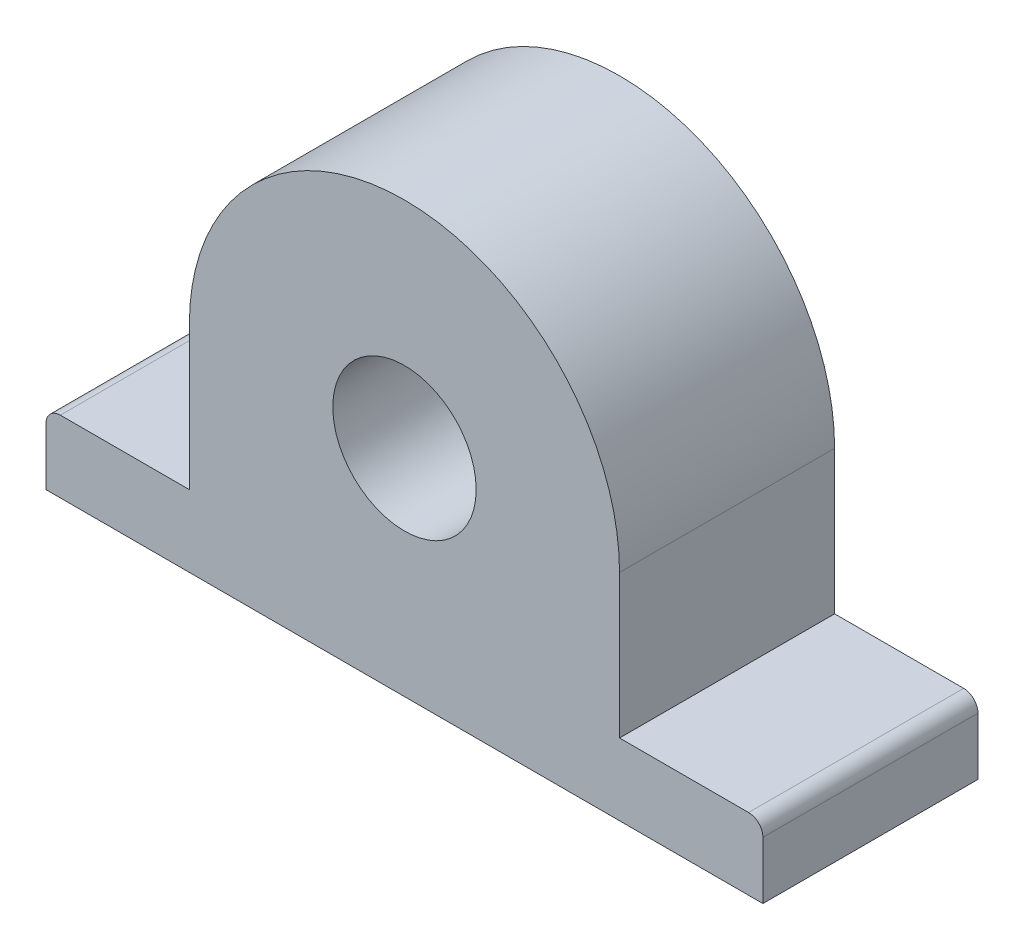
ISO-10303-21;
HEADER;
FILE_DESCRIPTION(('STEP AP214'),'2;1');
FILE_NAME('part.step','',(''),(''),'','','');
FILE_SCHEMA(('AUTOMOTIVE_DESIGN { 1 0 10303 214 1 1 1 1 }'));
ENDSEC;
DATA;
#1=APPLICATION_CONTEXT('core data for automotive mechanical design processes');
#2=APPLICATION_PROTOCOL_DEFINITION('international standard','automotive_design',2000,#1);
#3=PRODUCT_CONTEXT('',#1,'mechanical');
#4=PRODUCT('Part','Part','',(#3));
#5=PRODUCT_RELATED_PRODUCT_CATEGORY('part','',(#4));
#6=PRODUCT_DEFINITION_FORMATION('','',#4);
#7=PRODUCT_DEFINITION_CONTEXT('part definition',#1,'design');
#8=PRODUCT_DEFINITION('design','',#6,#7);
#9=PRODUCT_DEFINITION_SHAPE('','',#8);
#10=(LENGTH_UNIT() NAMED_UNIT(*) SI_UNIT(.MILLI.,.METRE.));
#11=(NAMED_UNIT(*) PLANE_ANGLE_UNIT() SI_UNIT($,.RADIAN.));
#12=(NAMED_UNIT(*) SI_UNIT($,.STERADIAN.) SOLID_ANGLE_UNIT());
#13=UNCERTAINTY_MEASURE_WITH_UNIT(LENGTH_MEASURE(1.E-05),#10,'distance_accuracy_value','');
#14=(GEOMETRIC_REPRESENTATION_CONTEXT(3) GLOBAL_UNCERTAINTY_ASSIGNED_CONTEXT((#13)) GLOBAL_UNIT_ASSIGNED_CONTEXT((#10,
#11,#12)) REPRESENTATION_CONTEXT('',''));
#15=CARTESIAN_POINT('',(0.,0.,0.));
#16=DIRECTION('',(0.,0.,1.));
#17=DIRECTION('',(1.,0.,0.));
#18=AXIS2_PLACEMENT_3D('',#15,#16,#17);
#19=CARTESIAN_POINT('',(0.,12.5,15.));
#20=DIRECTION('',(0.,0.,1.));
#21=DIRECTION('',(1.,0.,0.));
#22=AXIS2_PLACEMENT_3D('',#19,#20,#21);
#23=PLANE('',#22);
#24=DIRECTION('',(-1.,0.,0.));
#25=VECTOR('',#24,1.);
#26=CARTESIAN_POINT('',(-25.,2.5,15.));
#27=LINE('',#26,#25);
#28=CARTESIAN_POINT('',(-15.,2.5,15.));
#29=VERTEX_POINT('',#28);
#30=CARTESIAN_POINT('',(-24.,2.5,15.));
#31=VERTEX_POINT('',#30);
#32=EDGE_CURVE('E147',#29,#31,#27,.T.);
#33=ORIENTED_EDGE('',*,*,#32,.T.);
#34=CARTESIAN_POINT('',(-24.,1.5,15.));
#35=DIRECTION('',(0.,0.,1.));
#36=DIRECTION('',(1.,0.,0.));
#37=AXIS2_PLACEMENT_3D('',#34,#35,#36);
#38=CIRCLE('',#37,1.);
#39=CARTESIAN_POINT('',(-25.,1.5,15.));
#40=VERTEX_POINT('',#39);
#41=EDGE_CURVE('E192',#31,#40,#38,.T.);
#42=ORIENTED_EDGE('',*,*,#41,.T.);
#43=DIRECTION('',(0.,-1.,0.));
#44=VECTOR('',#43,1.);
#45=CARTESIAN_POINT('',(-25.,2.5,15.));
#46=LINE('',#45,#44);
#47=CARTESIAN_POINT('',(-25.,-2.5,15.));
#48=VERTEX_POINT('',#47);
#49=EDGE_CURVE('E149',#40,#48,#46,.T.);
#50=ORIENTED_EDGE('',*,*,#49,.T.);
#51=DIRECTION('',(1.,0.,0.));
#52=VECTOR('',#51,1.);
#53=CARTESIAN_POINT('',(-25.,-2.5,15.));
#54=LINE('',#53,#52);
#55=CARTESIAN_POINT('',(25.,-2.5,15.));
#56=VERTEX_POINT('',#55);
#57=EDGE_CURVE('E151',#48,#56,#54,.T.);
#58=ORIENTED_EDGE('',*,*,#57,.T.);
#59=DIRECTION('',(0.,1.,0.));
#60=VECTOR('',#59,1.);
#61=CARTESIAN_POINT('',(25.,2.5,15.));
#62=LINE('',#61,#60);
#63=CARTESIAN_POINT('',(25.,1.5,15.));
#64=VERTEX_POINT('',#63);
#65=EDGE_CURVE('E125',#56,#64,#62,.T.);
#66=ORIENTED_EDGE('',*,*,#65,.T.);
#67=CARTESIAN_POINT('',(24.,1.5,15.));
#68=DIRECTION('',(0.,0.,1.));
#69=DIRECTION('',(1.,0.,0.));
#70=AXIS2_PLACEMENT_3D('',#67,#68,#69);
#71=CIRCLE('',#70,1.);
#72=CARTESIAN_POINT('',(24.,2.5,15.));
#73=VERTEX_POINT('',#72);
#74=EDGE_CURVE('E56',#64,#73,#71,.T.);
#75=ORIENTED_EDGE('',*,*,#74,.T.);
#76=DIRECTION('',(-1.,0.,0.));
#77=VECTOR('',#76,1.);
#78=CARTESIAN_POINT('',(15.,2.5,15.));
#79=LINE('',#78,#77);
#80=CARTESIAN_POINT('',(15.,2.5,15.));
#81=VERTEX_POINT('',#80);
#82=EDGE_CURVE('E115',#73,#81,#79,.T.);
#83=ORIENTED_EDGE('',*,*,#82,.T.);
#84=DIRECTION('',(0.,1.,0.));
#85=VECTOR('',#84,1.);
#86=CARTESIAN_POINT('',(15.,12.5,15.));
#87=LINE('',#86,#85);
#88=CARTESIAN_POINT('',(15.,12.5,15.));
#89=VERTEX_POINT('',#88);
#90=EDGE_CURVE('E120',#81,#89,#87,.T.);
#91=ORIENTED_EDGE('',*,*,#90,.T.);
#92=CARTESIAN_POINT('',(0.,12.5,15.));
#93=DIRECTION('',(0.,0.,1.));
#94=DIRECTION('',(1.,0.,0.));
#95=AXIS2_PLACEMENT_3D('',#92,#93,#94);
#96=CIRCLE('',#95,15.);
#97=CARTESIAN_POINT('',(-15.,12.5,15.));
#98=VERTEX_POINT('',#97);
#99=EDGE_CURVE('E140',#89,#98,#96,.T.);
#100=ORIENTED_EDGE('',*,*,#99,.T.);
#101=DIRECTION('',(0.,-1.,0.));
#102=VECTOR('',#101,1.);
#103=CARTESIAN_POINT('',(-15.,12.5,15.));
#104=LINE('',#103,#102);
#105=EDGE_CURVE('E142',#98,#29,#104,.T.);
#106=ORIENTED_EDGE('',*,*,#105,.T.);
#107=EDGE_LOOP('',(#33,#42,#50,#58,#66,#75,#83,#91,#100,#106));
#108=FACE_BOUND('',#107,.T.);
#109=CARTESIAN_POINT('',(0.,12.5,15.));
#110=DIRECTION('',(0.,0.,1.));
#111=DIRECTION('',(1.,0.,0.));
#112=AXIS2_PLACEMENT_3D('',#109,#110,#111);
#113=CIRCLE('',#112,5.);
#114=CARTESIAN_POINT('',(5.,12.5,15.));
#115=VERTEX_POINT('',#114);
#116=EDGE_CURVE('E156',#115,#115,#113,.T.);
#117=ORIENTED_EDGE('',*,*,#116,.F.);
#118=EDGE_LOOP('',(#117));
#119=FACE_BOUND('',#118,.T.);
#120=ADVANCED_FACE('F41',(#108,#119),#23,.T.);
#121=CARTESIAN_POINT('',(0.,12.5,0.));
#122=DIRECTION('',(0.,0.,1.));
#123=DIRECTION('',(1.,0.,0.));
#124=AXIS2_PLACEMENT_3D('',#121,#122,#123);
#125=PLANE('',#124);
#126=DIRECTION('',(0.,-1.,0.));
#127=VECTOR('',#126,1.);
#128=CARTESIAN_POINT('',(-25.,2.5,0.));
#129=LINE('',#128,#127);
#130=CARTESIAN_POINT('',(-25.,1.5,0.));
#131=VERTEX_POINT('',#130);
#132=CARTESIAN_POINT('',(-25.,-2.5,0.));
#133=VERTEX_POINT('',#132);
#134=EDGE_CURVE('E167',#131,#133,#129,.T.);
#135=ORIENTED_EDGE('',*,*,#134,.F.);
#136=CARTESIAN_POINT('',(-24.,1.5,0.));
#137=DIRECTION('',(0.,0.,1.));
#138=DIRECTION('',(1.,0.,0.));
#139=AXIS2_PLACEMENT_3D('',#136,#137,#138);
#140=CIRCLE('',#139,1.);
#141=CARTESIAN_POINT('',(-24.,2.5,0.));
#142=VERTEX_POINT('',#141);
#143=EDGE_CURVE('E187',#131,#142,#140,.F.);
#144=ORIENTED_EDGE('',*,*,#143,.T.);
#145=DIRECTION('',(-1.,0.,0.));
#146=VECTOR('',#145,1.);
#147=CARTESIAN_POINT('',(-25.,2.5,0.));
#148=LINE('',#147,#146);
#149=CARTESIAN_POINT('',(-15.,2.5,0.));
#150=VERTEX_POINT('',#149);
#151=EDGE_CURVE('E164',#150,#142,#148,.T.);
#152=ORIENTED_EDGE('',*,*,#151,.F.);
#153=DIRECTION('',(0.,-1.,0.));
#154=VECTOR('',#153,1.);
#155=CARTESIAN_POINT('',(-15.,12.5,0.));
#156=LINE('',#155,#154);
#157=CARTESIAN_POINT('',(-15.,12.5,0.));
#158=VERTEX_POINT('',#157);
#159=EDGE_CURVE('E162',#158,#150,#156,.T.);
#160=ORIENTED_EDGE('',*,*,#159,.F.);
#161=CARTESIAN_POINT('',(0.,12.5,0.));
#162=DIRECTION('',(0.,0.,1.));
#163=DIRECTION('',(1.,0.,0.));
#164=AXIS2_PLACEMENT_3D('',#161,#162,#163);
#165=CIRCLE('',#164,15.);
#166=CARTESIAN_POINT('',(15.,12.5,0.));
#167=VERTEX_POINT('',#166);
#168=EDGE_CURVE('E160',#167,#158,#165,.T.);
#169=ORIENTED_EDGE('',*,*,#168,.F.);
#170=DIRECTION('',(0.,1.,0.));
#171=VECTOR('',#170,1.);
#172=CARTESIAN_POINT('',(15.,12.5,0.));
#173=LINE('',#172,#171);
#174=CARTESIAN_POINT('',(15.,2.5,0.));
#175=VERTEX_POINT('',#174);
#176=EDGE_CURVE('E158',#175,#167,#173,.T.);
#177=ORIENTED_EDGE('',*,*,#176,.F.);
#178=DIRECTION('',(-1.,0.,0.));
#179=VECTOR('',#178,1.);
#180=CARTESIAN_POINT('',(15.,2.5,0.));
#181=LINE('',#180,#179);
#182=CARTESIAN_POINT('',(24.,2.5,0.));
#183=VERTEX_POINT('',#182);
#184=EDGE_CURVE('E131',#183,#175,#181,.T.);
#185=ORIENTED_EDGE('',*,*,#184,.F.);
#186=CARTESIAN_POINT('',(24.,1.5,0.));
#187=DIRECTION('',(0.,0.,1.));
#188=DIRECTION('',(1.,0.,0.));
#189=AXIS2_PLACEMENT_3D('',#186,#187,#188);
#190=CIRCLE('',#189,1.);
#191=CARTESIAN_POINT('',(25.,1.5,0.));
#192=VERTEX_POINT('',#191);
#193=EDGE_CURVE('E185',#183,#192,#190,.F.);
#194=ORIENTED_EDGE('',*,*,#193,.T.);
#195=DIRECTION('',(0.,1.,0.));
#196=VECTOR('',#195,1.);
#197=CARTESIAN_POINT('',(25.,2.5,0.));
#198=LINE('',#197,#196);
#199=CARTESIAN_POINT('',(25.,-2.5,0.));
#200=VERTEX_POINT('',#199);
#201=EDGE_CURVE('E154',#200,#192,#198,.T.);
#202=ORIENTED_EDGE('',*,*,#201,.F.);
#203=DIRECTION('',(1.,0.,0.));
#204=VECTOR('',#203,1.);
#205=CARTESIAN_POINT('',(-25.,-2.5,0.));
#206=LINE('',#205,#204);
#207=EDGE_CURVE('E169',#133,#200,#206,.T.);
#208=ORIENTED_EDGE('',*,*,#207,.F.);
#209=EDGE_LOOP('',(#135,#144,#152,#160,#169,#177,#185,#194,#202,#208));
#210=FACE_BOUND('',#209,.T.);
#211=CARTESIAN_POINT('',(0.,12.5,0.));
#212=DIRECTION('',(0.,0.,1.));
#213=DIRECTION('',(1.,0.,0.));
#214=AXIS2_PLACEMENT_3D('',#211,#212,#213);
#215=CIRCLE('',#214,5.);
#216=CARTESIAN_POINT('',(5.,12.5,0.));
#217=VERTEX_POINT('',#216);
#218=EDGE_CURVE('E336',#217,#217,#215,.T.);
#219=ORIENTED_EDGE('',*,*,#218,.T.);
#220=EDGE_LOOP('',(#219));
#221=FACE_BOUND('',#220,.T.);
#222=ADVANCED_FACE('F196',(#210,#221),#125,.F.);
#223=CARTESIAN_POINT('',(25.,2.5,15.));
#224=DIRECTION('',(-1.,0.,0.));
#225=DIRECTION('',(0.,0.,1.));
#226=AXIS2_PLACEMENT_3D('',#223,#224,#225);
#227=PLANE('',#226);
#228=ORIENTED_EDGE('',*,*,#201,.T.);
#229=DIRECTION('',(0.,0.,-1.));
#230=VECTOR('',#229,1.);
#231=CARTESIAN_POINT('',(25.,1.5,15.));
#232=LINE('',#231,#230);
#233=EDGE_CURVE('E11',#192,#64,#232,.F.);
#234=ORIENTED_EDGE('',*,*,#233,.T.);
#235=ORIENTED_EDGE('',*,*,#65,.F.);
#236=DIRECTION('',(0.,0.,-1.));
#237=VECTOR('',#236,1.);
#238=CARTESIAN_POINT('',(25.,-2.5,15.));
#239=LINE('',#238,#237);
#240=EDGE_CURVE('E153',#56,#200,#239,.T.);
#241=ORIENTED_EDGE('',*,*,#240,.T.);
#242=EDGE_LOOP('',(#228,#234,#235,#241));
#243=FACE_BOUND('',#242,.T.);
#244=ADVANCED_FACE('F237',(#243),#227,.F.);
#245=CARTESIAN_POINT('',(15.,2.5,15.));
#246=DIRECTION('',(0.,-1.,0.));
#247=DIRECTION('',(1.,0.,0.));
#248=AXIS2_PLACEMENT_3D('',#245,#246,#247);
#249=PLANE('',#248);
#250=ORIENTED_EDGE('',*,*,#82,.F.);
#251=DIRECTION('',(0.,0.,-1.));
#252=VECTOR('',#251,1.);
#253=CARTESIAN_POINT('',(24.,2.5,15.));
#254=LINE('',#253,#252);
#255=EDGE_CURVE('E49',#73,#183,#254,.T.);
#256=ORIENTED_EDGE('',*,*,#255,.T.);
#257=ORIENTED_EDGE('',*,*,#184,.T.);
#258=DIRECTION('',(0.,0.,-1.));
#259=VECTOR('',#258,1.);
#260=CARTESIAN_POINT('',(15.,2.5,15.));
#261=LINE('',#260,#259);
#262=EDGE_CURVE('E128',#81,#175,#261,.T.);
#263=ORIENTED_EDGE('',*,*,#262,.F.);
#264=EDGE_LOOP('',(#250,#256,#257,#263));
#265=FACE_BOUND('',#264,.T.);
#266=ADVANCED_FACE('F129',(#265),#249,.F.);
#267=CARTESIAN_POINT('',(15.,12.5,15.));
#268=DIRECTION('',(-1.,0.,0.));
#269=DIRECTION('',(0.,-1.,0.));
#270=AXIS2_PLACEMENT_3D('',#267,#268,#269);
#271=PLANE('',#270);
#272=ORIENTED_EDGE('',*,*,#176,.T.);
#273=DIRECTION('',(0.,0.,-1.));
#274=VECTOR('',#273,1.);
#275=CARTESIAN_POINT('',(15.,12.5,15.));
#276=LINE('',#275,#274);
#277=EDGE_CURVE('E135',#89,#167,#276,.T.);
#278=ORIENTED_EDGE('',*,*,#277,.F.);
#279=ORIENTED_EDGE('',*,*,#90,.F.);
#280=ORIENTED_EDGE('',*,*,#262,.T.);
#281=EDGE_LOOP('',(#272,#278,#279,#280));
#282=FACE_BOUND('',#281,.T.);
#283=ADVANCED_FACE('F137',(#282),#271,.F.);
#284=CARTESIAN_POINT('',(0.,12.5,15.));
#285=DIRECTION('',(0.,0.,-1.));
#286=DIRECTION('',(-1.,0.,0.));
#287=AXIS2_PLACEMENT_3D('',#284,#285,#286);
#288=CYLINDRICAL_SURFACE('',#287,15.);
#289=ORIENTED_EDGE('',*,*,#168,.T.);
#290=DIRECTION('',(0.,0.,-1.));
#291=VECTOR('',#290,1.);
#292=CARTESIAN_POINT('',(-15.,12.5,15.));
#293=LINE('',#292,#291);
#294=EDGE_CURVE('E179',#98,#158,#293,.T.);
#295=ORIENTED_EDGE('',*,*,#294,.F.);
#296=ORIENTED_EDGE('',*,*,#99,.F.);
#297=ORIENTED_EDGE('',*,*,#277,.T.);
#298=EDGE_LOOP('',(#289,#295,#296,#297));
#299=FACE_BOUND('',#298,.T.);
#300=ADVANCED_FACE('F202',(#299),#288,.T.);
#301=CARTESIAN_POINT('',(-15.,12.5,15.));
#302=DIRECTION('',(1.,0.,0.));
#303=DIRECTION('',(0.,1.,0.));
#304=AXIS2_PLACEMENT_3D('',#301,#302,#303);
#305=PLANE('',#304);
#306=ORIENTED_EDGE('',*,*,#159,.T.);
#307=DIRECTION('',(0.,0.,-1.));
#308=VECTOR('',#307,1.);
#309=CARTESIAN_POINT('',(-15.,2.5,15.));
#310=LINE('',#309,#308);
#311=EDGE_CURVE('E176',#29,#150,#310,.T.);
#312=ORIENTED_EDGE('',*,*,#311,.F.);
#313=ORIENTED_EDGE('',*,*,#105,.F.);
#314=ORIENTED_EDGE('',*,*,#294,.T.);
#315=EDGE_LOOP('',(#306,#312,#313,#314));
#316=FACE_BOUND('',#315,.T.);
#317=ADVANCED_FACE('F209',(#316),#305,.F.);
#318=CARTESIAN_POINT('',(-25.,2.5,15.));
#319=DIRECTION('',(0.,-1.,0.));
#320=DIRECTION('',(0.,0.,-1.));
#321=AXIS2_PLACEMENT_3D('',#318,#319,#320);
#322=PLANE('',#321);
#323=ORIENTED_EDGE('',*,*,#151,.T.);
#324=DIRECTION('',(0.,0.,-1.));
#325=VECTOR('',#324,1.);
#326=CARTESIAN_POINT('',(-24.,2.5,15.));
#327=LINE('',#326,#325);
#328=EDGE_CURVE('E189',#142,#31,#327,.F.);
#329=ORIENTED_EDGE('',*,*,#328,.T.);
#330=ORIENTED_EDGE('',*,*,#32,.F.);
#331=ORIENTED_EDGE('',*,*,#311,.T.);
#332=EDGE_LOOP('',(#323,#329,#330,#331));
#333=FACE_BOUND('',#332,.T.);
#334=ADVANCED_FACE('F212',(#333),#322,.F.);
#335=CARTESIAN_POINT('',(-25.,2.5,15.));
#336=DIRECTION('',(1.,0.,0.));
#337=DIRECTION('',(0.,0.,-1.));
#338=AXIS2_PLACEMENT_3D('',#335,#336,#337);
#339=PLANE('',#338);
#340=ORIENTED_EDGE('',*,*,#49,.F.);
#341=DIRECTION('',(0.,0.,-1.));
#342=VECTOR('',#341,1.);
#343=CARTESIAN_POINT('',(-25.,1.5,15.));
#344=LINE('',#343,#342);
#345=EDGE_CURVE('E134',#40,#131,#344,.T.);
#346=ORIENTED_EDGE('',*,*,#345,.T.);
#347=ORIENTED_EDGE('',*,*,#134,.T.);
#348=DIRECTION('',(0.,0.,-1.));
#349=VECTOR('',#348,1.);
#350=CARTESIAN_POINT('',(-25.,-2.5,15.));
#351=LINE('',#350,#349);
#352=EDGE_CURVE('E173',#48,#133,#351,.T.);
#353=ORIENTED_EDGE('',*,*,#352,.F.);
#354=EDGE_LOOP('',(#340,#346,#347,#353));
#355=FACE_BOUND('',#354,.T.);
#356=ADVANCED_FACE('F220',(#355),#339,.F.);
#357=CARTESIAN_POINT('',(-25.,-2.5,15.));
#358=DIRECTION('',(0.,1.,0.));
#359=DIRECTION('',(0.,0.,1.));
#360=AXIS2_PLACEMENT_3D('',#357,#358,#359);
#361=PLANE('',#360);
#362=ORIENTED_EDGE('',*,*,#207,.T.);
#363=ORIENTED_EDGE('',*,*,#240,.F.);
#364=ORIENTED_EDGE('',*,*,#57,.F.);
#365=ORIENTED_EDGE('',*,*,#352,.T.);
#366=EDGE_LOOP('',(#362,#363,#364,#365));
#367=FACE_BOUND('',#366,.T.);
#368=ADVANCED_FACE('F225',(#367),#361,.F.);
#369=CARTESIAN_POINT('',(0.,12.5,15.));
#370=DIRECTION('',(0.,0.,-1.));
#371=DIRECTION('',(-1.,0.,0.));
#372=AXIS2_PLACEMENT_3D('',#369,#370,#371);
#373=CYLINDRICAL_SURFACE('',#372,5.);
#374=ORIENTED_EDGE('',*,*,#116,.T.);
#375=EDGE_LOOP('',(#374));
#376=FACE_BOUND('',#375,.T.);
#377=ORIENTED_EDGE('',*,*,#218,.F.);
#378=EDGE_LOOP('',(#377));
#379=FACE_BOUND('',#378,.T.);
#380=ADVANCED_FACE('F230',(#376,#379),#373,.F.);
#381=CARTESIAN_POINT('',(-24.,1.5,15.));
#382=DIRECTION('',(0.,0.,-1.));
#383=DIRECTION('',(-1.,0.,0.));
#384=AXIS2_PLACEMENT_3D('',#381,#382,#383);
#385=CYLINDRICAL_SURFACE('',#384,1.);
#386=ORIENTED_EDGE('',*,*,#41,.F.);
#387=ORIENTED_EDGE('',*,*,#328,.F.);
#388=ORIENTED_EDGE('',*,*,#143,.F.);
#389=ORIENTED_EDGE('',*,*,#345,.F.);
#390=EDGE_LOOP('',(#386,#387,#388,#389));
#391=FACE_BOUND('',#390,.T.);
#392=ADVANCED_FACE('F215',(#391),#385,.T.);
#393=CARTESIAN_POINT('',(24.,1.5,15.));
#394=DIRECTION('',(0.,0.,-1.));
#395=DIRECTION('',(-1.,0.,0.));
#396=AXIS2_PLACEMENT_3D('',#393,#394,#395);
#397=CYLINDRICAL_SURFACE('',#396,1.);
#398=ORIENTED_EDGE('',*,*,#74,.F.);
#399=ORIENTED_EDGE('',*,*,#233,.F.);
#400=ORIENTED_EDGE('',*,*,#193,.F.);
#401=ORIENTED_EDGE('',*,*,#255,.F.);
#402=EDGE_LOOP('',(#398,#399,#400,#401));
#403=FACE_BOUND('',#402,.T.);
#404=ADVANCED_FACE('F43',(#403),#397,.T.);
#405=CLOSED_SHELL('',(#120,#222,#244,#266,#283,#300,#317,#334,#356,#368,#380,#392,#404));
#406=MANIFOLD_SOLID_BREP('B2',#405);
#407=ADVANCED_BREP_SHAPE_REPRESENTATION('',(#18,#406),#14);
#408=SHAPE_DEFINITION_REPRESENTATION(#9,#407);
ENDSEC;
END-ISO-10303-21;
